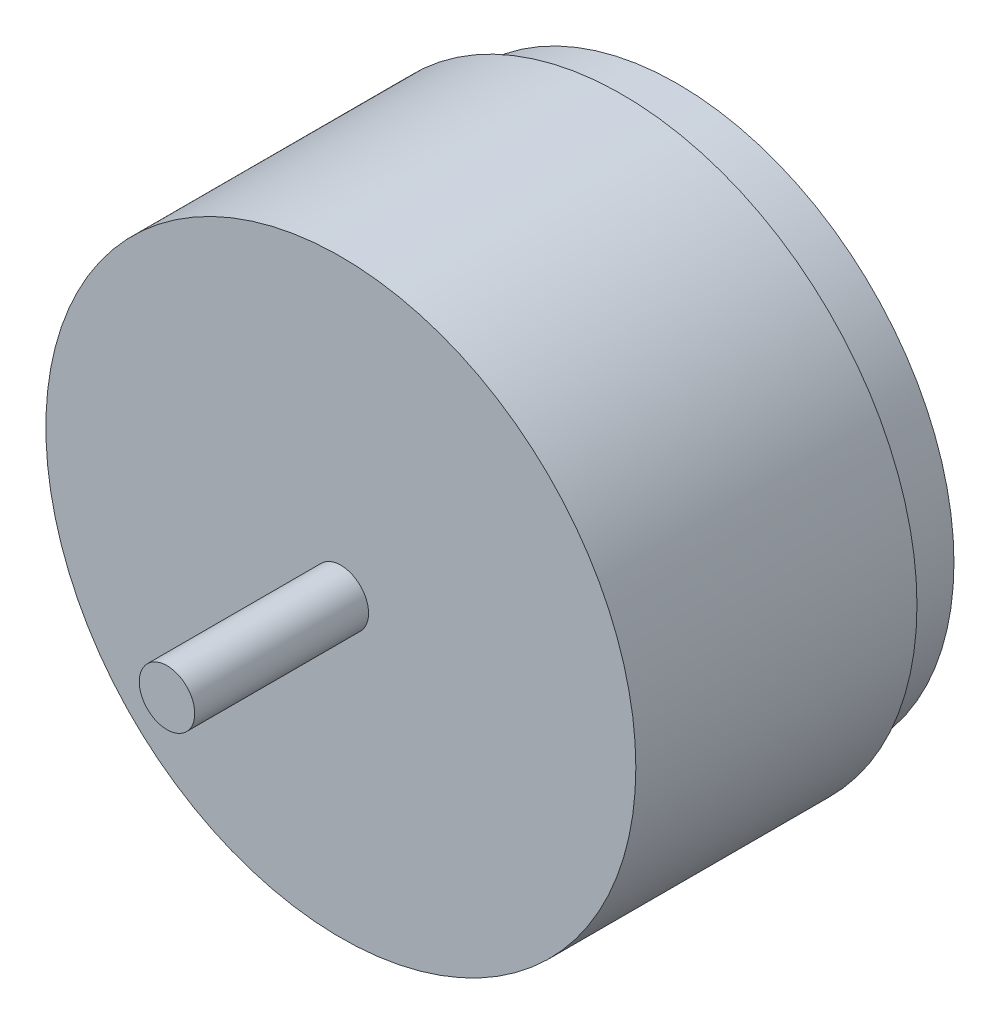
ISO-10303-21;
HEADER;
FILE_DESCRIPTION(('STEP AP214'),'2;1');
FILE_NAME('part.step','',(''),(''),'','','');
FILE_SCHEMA(('AUTOMOTIVE_DESIGN { 1 0 10303 214 1 1 1 1 }'));
ENDSEC;
DATA;
#1=APPLICATION_CONTEXT('core data for automotive mechanical design processes');
#2=APPLICATION_PROTOCOL_DEFINITION('international standard','automotive_design',2000,#1);
#3=PRODUCT_CONTEXT('',#1,'mechanical');
#4=PRODUCT('Part','Part','',(#3));
#5=PRODUCT_RELATED_PRODUCT_CATEGORY('part','',(#4));
#6=PRODUCT_DEFINITION_FORMATION('','',#4);
#7=PRODUCT_DEFINITION_CONTEXT('part definition',#1,'design');
#8=PRODUCT_DEFINITION('design','',#6,#7);
#9=PRODUCT_DEFINITION_SHAPE('','',#8);
#10=(LENGTH_UNIT() NAMED_UNIT(*) SI_UNIT(.MILLI.,.METRE.));
#11=(NAMED_UNIT(*) PLANE_ANGLE_UNIT() SI_UNIT($,.RADIAN.));
#12=(NAMED_UNIT(*) SI_UNIT($,.STERADIAN.) SOLID_ANGLE_UNIT());
#13=UNCERTAINTY_MEASURE_WITH_UNIT(LENGTH_MEASURE(1.E-05),#10,'distance_accuracy_value','');
#14=(GEOMETRIC_REPRESENTATION_CONTEXT(3) GLOBAL_UNCERTAINTY_ASSIGNED_CONTEXT((#13)) GLOBAL_UNIT_ASSIGNED_CONTEXT((#10,
#11,#12)) REPRESENTATION_CONTEXT('',''));
#15=CARTESIAN_POINT('',(0.,0.,0.));
#16=DIRECTION('',(0.,0.,1.));
#17=DIRECTION('',(1.,0.,0.));
#18=AXIS2_PLACEMENT_3D('',#15,#16,#17);
#19=CARTESIAN_POINT('',(-45.57303204747,45.573032047473,13.8));
#20=DIRECTION('',(0.,0.,1.));
#21=DIRECTION('',(1.,0.,0.));
#22=AXIS2_PLACEMENT_3D('',#19,#20,#21);
#23=PLANE('',#22);
#24=CARTESIAN_POINT('',(-45.57303204747,45.573032047473,13.8));
#25=DIRECTION('',(0.,0.,1.));
#26=DIRECTION('',(1.,0.,0.));
#27=AXIS2_PLACEMENT_3D('',#24,#25,#26);
#28=CIRCLE('',#27,0.75);
#29=CARTESIAN_POINT('',(-44.82303204747,45.573032047473,13.8));
#30=VERTEX_POINT('',#29);
#31=EDGE_CURVE('E9',#30,#30,#28,.T.);
#32=ORIENTED_EDGE('',*,*,#31,.T.);
#33=EDGE_LOOP('',(#32));
#34=FACE_BOUND('',#33,.T.);
#35=ADVANCED_FACE('F15',(#34),#23,.T.);
#36=CARTESIAN_POINT('',(-45.57303204747,45.573032047473,0.));
#37=DIRECTION('',(0.,0.,1.));
#38=DIRECTION('',(1.,0.,0.));
#39=AXIS2_PLACEMENT_3D('',#36,#37,#38);
#40=PLANE('',#39);
#41=CARTESIAN_POINT('',(-45.57303204747,45.573032047473,0.));
#42=DIRECTION('',(0.,0.,1.));
#43=DIRECTION('',(1.,0.,0.));
#44=AXIS2_PLACEMENT_3D('',#41,#42,#43);
#45=CIRCLE('',#44,7.475);
#46=CARTESIAN_POINT('',(-38.09803204747,45.573032047473,0.));
#47=VERTEX_POINT('',#46);
#48=EDGE_CURVE('E81',#47,#47,#45,.T.);
#49=ORIENTED_EDGE('',*,*,#48,.F.);
#50=EDGE_LOOP('',(#49));
#51=FACE_BOUND('',#50,.T.);
#52=ADVANCED_FACE('F89',(#51),#40,.F.);
#53=CARTESIAN_POINT('',(-45.57303204747,45.573032047473,9.1));
#54=DIRECTION('',(0.,0.,-1.));
#55=DIRECTION('',(1.,0.,0.));
#56=AXIS2_PLACEMENT_3D('',#53,#54,#55);
#57=CYLINDRICAL_SURFACE('',#56,0.75);
#58=CARTESIAN_POINT('',(-45.57303204747,45.573032047473,9.1));
#59=DIRECTION('',(0.,0.,1.));
#60=DIRECTION('',(1.,0.,0.));
#61=AXIS2_PLACEMENT_3D('',#58,#59,#60);
#62=CIRCLE('',#61,0.75);
#63=CARTESIAN_POINT('',(-44.82303204747,45.573032047473,9.1));
#64=VERTEX_POINT('',#63);
#65=EDGE_CURVE('E77',#64,#64,#62,.T.);
#66=ORIENTED_EDGE('',*,*,#65,.T.);
#67=DIRECTION('',(0.,0.,1.));
#68=VECTOR('',#67,1.);
#69=CARTESIAN_POINT('',(-44.82303204747,45.573032047473,9.1));
#70=LINE('',#69,#68);
#71=EDGE_CURVE('E18',#64,#30,#70,.T.);
#72=ORIENTED_EDGE('',*,*,#71,.T.);
#73=ORIENTED_EDGE('',*,*,#31,.F.);
#74=ORIENTED_EDGE('',*,*,#71,.F.);
#75=EDGE_LOOP('',(#66,#72,#73,#74));
#76=FACE_BOUND('',#75,.T.);
#77=ADVANCED_FACE('F95',(#76),#57,.T.);
#78=CARTESIAN_POINT('',(-45.57303204747,45.573032047473,0.));
#79=DIRECTION('',(0.,0.,-1.));
#80=DIRECTION('',(1.,0.,0.));
#81=AXIS2_PLACEMENT_3D('',#78,#79,#80);
#82=CYLINDRICAL_SURFACE('',#81,7.475);
#83=ORIENTED_EDGE('',*,*,#48,.T.);
#84=DIRECTION('',(0.,0.,1.));
#85=VECTOR('',#84,1.);
#86=CARTESIAN_POINT('',(-38.09803204747,45.573032047473,0.));
#87=LINE('',#86,#85);
#88=CARTESIAN_POINT('',(-38.09803204747,45.573032047473,1.5));
#89=VERTEX_POINT('',#88);
#90=EDGE_CURVE('E41',#47,#89,#87,.T.);
#91=ORIENTED_EDGE('',*,*,#90,.T.);
#92=CARTESIAN_POINT('',(-45.57303204747,45.573032047473,1.5));
#93=DIRECTION('',(0.,0.,1.));
#94=DIRECTION('',(1.,0.,0.));
#95=AXIS2_PLACEMENT_3D('',#92,#93,#94);
#96=CIRCLE('',#95,7.475);
#97=EDGE_CURVE('E75',#89,#89,#96,.T.);
#98=ORIENTED_EDGE('',*,*,#97,.F.);
#99=ORIENTED_EDGE('',*,*,#90,.F.);
#100=EDGE_LOOP('',(#83,#91,#98,#99));
#101=FACE_BOUND('',#100,.T.);
#102=ADVANCED_FACE('F86',(#101),#82,.T.);
#103=CARTESIAN_POINT('',(-45.57303204747,45.573032047473,9.1));
#104=DIRECTION('',(0.,0.,1.));
#105=DIRECTION('',(1.,0.,0.));
#106=AXIS2_PLACEMENT_3D('',#103,#104,#105);
#107=PLANE('',#106);
#108=ORIENTED_EDGE('',*,*,#65,.F.);
#109=EDGE_LOOP('',(#108));
#110=FACE_BOUND('',#109,.T.);
#111=CARTESIAN_POINT('',(-45.57303204747,45.573032047473,9.1));
#112=DIRECTION('',(0.,0.,1.));
#113=DIRECTION('',(1.,0.,0.));
#114=AXIS2_PLACEMENT_3D('',#111,#112,#113);
#115=CIRCLE('',#114,7.975);
#116=CARTESIAN_POINT('',(-37.59803204747,45.573032047473,9.1));
#117=VERTEX_POINT('',#116);
#118=EDGE_CURVE('E65',#117,#117,#115,.T.);
#119=ORIENTED_EDGE('',*,*,#118,.T.);
#120=EDGE_LOOP('',(#119));
#121=FACE_BOUND('',#120,.T.);
#122=ADVANCED_FACE('F103',(#110,#121),#107,.T.);
#123=CARTESIAN_POINT('',(-45.57303204747,45.573032047473,1.5));
#124=DIRECTION('',(0.,0.,1.));
#125=DIRECTION('',(1.,0.,0.));
#126=AXIS2_PLACEMENT_3D('',#123,#124,#125);
#127=PLANE('',#126);
#128=ORIENTED_EDGE('',*,*,#97,.T.);
#129=EDGE_LOOP('',(#128));
#130=FACE_BOUND('',#129,.T.);
#131=CARTESIAN_POINT('',(-45.57303204747,45.573032047473,1.5));
#132=DIRECTION('',(0.,0.,1.));
#133=DIRECTION('',(1.,0.,0.));
#134=AXIS2_PLACEMENT_3D('',#131,#132,#133);
#135=CIRCLE('',#134,7.975);
#136=CARTESIAN_POINT('',(-37.59803204747,45.573032047473,1.5));
#137=VERTEX_POINT('',#136);
#138=EDGE_CURVE('E63',#137,#137,#135,.T.);
#139=ORIENTED_EDGE('',*,*,#138,.F.);
#140=EDGE_LOOP('',(#139));
#141=FACE_BOUND('',#140,.T.);
#142=ADVANCED_FACE('F106',(#130,#141),#127,.F.);
#143=CARTESIAN_POINT('',(-45.57303204747,45.573032047473,1.5));
#144=DIRECTION('',(0.,0.,-1.));
#145=DIRECTION('',(1.,0.,0.));
#146=AXIS2_PLACEMENT_3D('',#143,#144,#145);
#147=CYLINDRICAL_SURFACE('',#146,7.975);
#148=ORIENTED_EDGE('',*,*,#138,.T.);
#149=DIRECTION('',(0.,0.,1.));
#150=VECTOR('',#149,1.);
#151=CARTESIAN_POINT('',(-37.59803204747,45.573032047473,1.5));
#152=LINE('',#151,#150);
#153=EDGE_CURVE('E61',#137,#117,#152,.T.);
#154=ORIENTED_EDGE('',*,*,#153,.T.);
#155=ORIENTED_EDGE('',*,*,#118,.F.);
#156=ORIENTED_EDGE('',*,*,#153,.F.);
#157=EDGE_LOOP('',(#148,#154,#155,#156));
#158=FACE_BOUND('',#157,.T.);
#159=ADVANCED_FACE('F62',(#158),#147,.T.);
#160=CLOSED_SHELL('',(#35,#52,#77,#102,#122,#142,#159));
#161=MANIFOLD_SOLID_BREP('B1',#160);
#162=ADVANCED_BREP_SHAPE_REPRESENTATION('',(#18,#161),#14);
#163=SHAPE_DEFINITION_REPRESENTATION(#9,#162);
ENDSEC;
END-ISO-10303-21;
